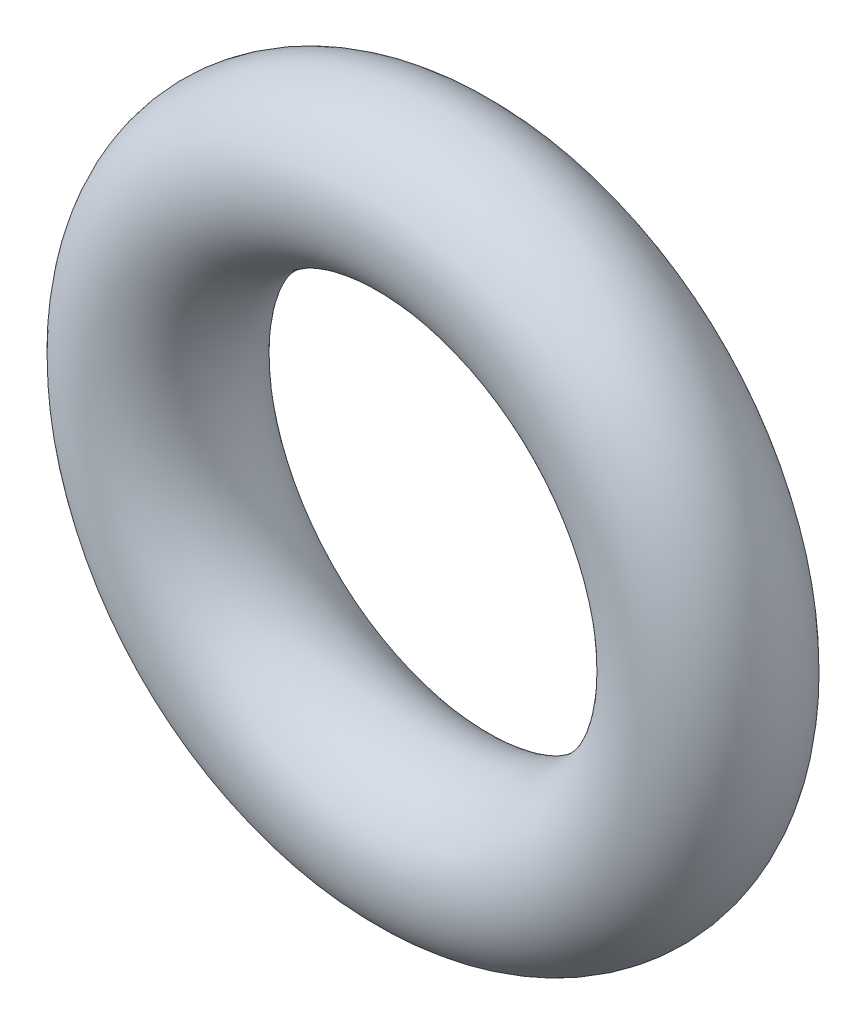
ISO-10303-21;
HEADER;
FILE_DESCRIPTION(('STEP AP214'),'2;1');
FILE_NAME('part.step','',(''),(''),'','','');
FILE_SCHEMA(('AUTOMOTIVE_DESIGN { 1 0 10303 214 1 1 1 1 }'));
ENDSEC;
DATA;
#1=APPLICATION_CONTEXT('core data for automotive mechanical design processes');
#2=APPLICATION_PROTOCOL_DEFINITION('international standard','automotive_design',2000,#1);
#3=PRODUCT_CONTEXT('',#1,'mechanical');
#4=PRODUCT('Part','Part','',(#3));
#5=PRODUCT_RELATED_PRODUCT_CATEGORY('part','',(#4));
#6=PRODUCT_DEFINITION_FORMATION('','',#4);
#7=PRODUCT_DEFINITION_CONTEXT('part definition',#1,'design');
#8=PRODUCT_DEFINITION('design','',#6,#7);
#9=PRODUCT_DEFINITION_SHAPE('','',#8);
#10=(LENGTH_UNIT() NAMED_UNIT(*) SI_UNIT(.MILLI.,.METRE.));
#11=(NAMED_UNIT(*) PLANE_ANGLE_UNIT() SI_UNIT($,.RADIAN.));
#12=(NAMED_UNIT(*) SI_UNIT($,.STERADIAN.) SOLID_ANGLE_UNIT());
#13=UNCERTAINTY_MEASURE_WITH_UNIT(LENGTH_MEASURE(1.E-05),#10,'distance_accuracy_value','');
#14=(GEOMETRIC_REPRESENTATION_CONTEXT(3) GLOBAL_UNCERTAINTY_ASSIGNED_CONTEXT((#13)) GLOBAL_UNIT_ASSIGNED_CONTEXT((#10,
#11,#12)) REPRESENTATION_CONTEXT('',''));
#15=CARTESIAN_POINT('',(0.,0.,0.));
#16=DIRECTION('',(0.,0.,1.));
#17=DIRECTION('',(1.,0.,0.));
#18=AXIS2_PLACEMENT_3D('',#15,#16,#17);
#19=CARTESIAN_POINT('',(0.,0.,0.));
#20=DIRECTION('',(0.,0.,-1.));
#21=DIRECTION('',(-1.,0.,0.));
#22=AXIS2_PLACEMENT_3D('',#19,#20,#21);
#23=TOROIDAL_SURFACE('',#22,1.75,0.5);
#24=CARTESIAN_POINT('',(-2.25,0.,0.));
#25=VERTEX_POINT('',#24);
#26=VERTEX_LOOP('',#25);
#27=FACE_BOUND('',#26,.T.);
#28=ADVANCED_FACE('F30',(#27),#23,.T.);
#29=CLOSED_SHELL('',(#28));
#30=MANIFOLD_SOLID_BREP('B2',#29);
#31=ADVANCED_BREP_SHAPE_REPRESENTATION('',(#18,#30),#14);
#32=SHAPE_DEFINITION_REPRESENTATION(#9,#31);
ENDSEC;
END-ISO-10303-21;
